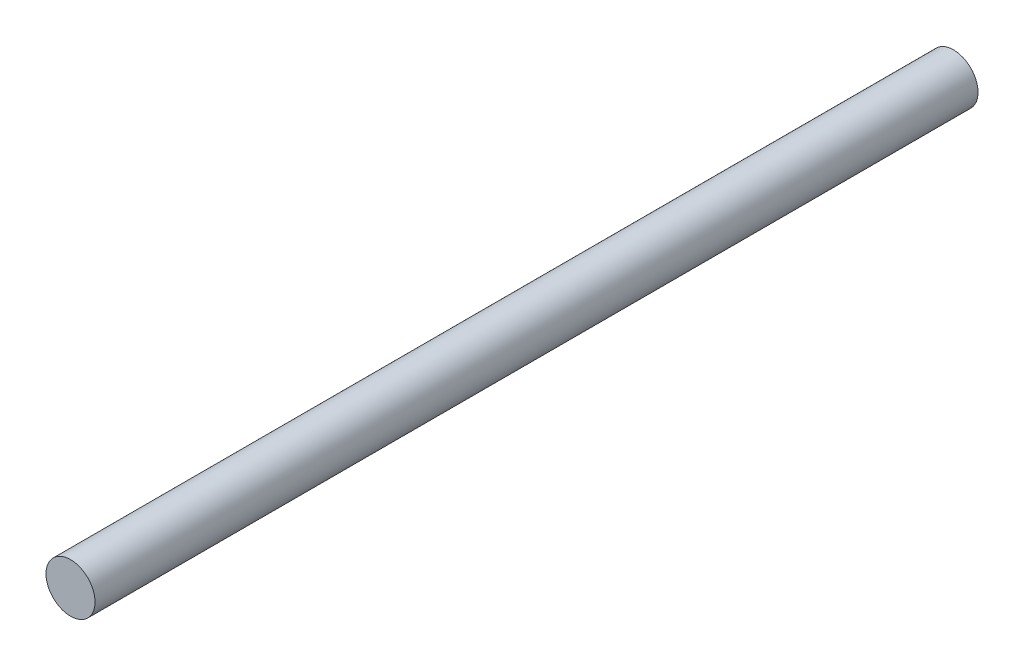
ISO-10303-21;
HEADER;
FILE_DESCRIPTION(('STEP AP214'),'2;1');
FILE_NAME('part.step','',(''),(''),'','','');
FILE_SCHEMA(('AUTOMOTIVE_DESIGN { 1 0 10303 214 1 1 1 1 }'));
ENDSEC;
DATA;
#1=APPLICATION_CONTEXT('core data for automotive mechanical design processes');
#2=APPLICATION_PROTOCOL_DEFINITION('international standard','automotive_design',2000,#1);
#3=PRODUCT_CONTEXT('',#1,'mechanical');
#4=PRODUCT('Part','Part','',(#3));
#5=PRODUCT_RELATED_PRODUCT_CATEGORY('part','',(#4));
#6=PRODUCT_DEFINITION_FORMATION('','',#4);
#7=PRODUCT_DEFINITION_CONTEXT('part definition',#1,'design');
#8=PRODUCT_DEFINITION('design','',#6,#7);
#9=PRODUCT_DEFINITION_SHAPE('','',#8);
#10=(LENGTH_UNIT() NAMED_UNIT(*) SI_UNIT(.MILLI.,.METRE.));
#11=(NAMED_UNIT(*) PLANE_ANGLE_UNIT() SI_UNIT($,.RADIAN.));
#12=(NAMED_UNIT(*) SI_UNIT($,.STERADIAN.) SOLID_ANGLE_UNIT());
#13=UNCERTAINTY_MEASURE_WITH_UNIT(LENGTH_MEASURE(1.E-05),#10,'distance_accuracy_value','');
#14=(GEOMETRIC_REPRESENTATION_CONTEXT(3) GLOBAL_UNCERTAINTY_ASSIGNED_CONTEXT((#13)) GLOBAL_UNIT_ASSIGNED_CONTEXT((#10,
#11,#12)) REPRESENTATION_CONTEXT('',''));
#15=CARTESIAN_POINT('',(0.,0.,0.));
#16=DIRECTION('',(0.,0.,1.));
#17=DIRECTION('',(1.,0.,0.));
#18=AXIS2_PLACEMENT_3D('',#15,#16,#17);
#19=CARTESIAN_POINT('',(0.,0.,90.));
#20=DIRECTION('',(0.,0.,-1.));
#21=DIRECTION('',(-1.,0.,0.));
#22=AXIS2_PLACEMENT_3D('',#19,#20,#21);
#23=CYLINDRICAL_SURFACE('',#22,2.5);
#24=CARTESIAN_POINT('',(0.,0.,90.));
#25=DIRECTION('',(0.,0.,1.));
#26=DIRECTION('',(1.,0.,0.));
#27=AXIS2_PLACEMENT_3D('',#24,#25,#26);
#28=CIRCLE('',#27,2.5);
#29=CARTESIAN_POINT('',(-2.5,0.,90.));
#30=VERTEX_POINT('',#29);
#31=EDGE_CURVE('E10',#30,#30,#28,.T.);
#32=CARTESIAN_POINT('',(0.,0.,0.));
#33=DIRECTION('',(0.,0.,1.));
#34=DIRECTION('',(1.,0.,0.));
#35=AXIS2_PLACEMENT_3D('',#32,#33,#34);
#36=CIRCLE('',#35,2.5);
#37=CARTESIAN_POINT('',(-2.5,0.,0.));
#38=VERTEX_POINT('',#37);
#39=EDGE_CURVE('E42',#38,#38,#36,.T.);
#40=CARTESIAN_POINT('',(-2.5,0.,90.));
#41=CARTESIAN_POINT('',(-2.5,0.,89.0625));
#42=CARTESIAN_POINT('',(-2.5,0.,88.125));
#43=CARTESIAN_POINT('',(-2.5,0.,86.25));
#44=CARTESIAN_POINT('',(-2.5,0.,85.3125));
#45=CARTESIAN_POINT('',(-2.5,0.,83.4375));
#46=CARTESIAN_POINT('',(-2.5,0.,82.5));
#47=CARTESIAN_POINT('',(-2.5,0.,80.625));
#48=CARTESIAN_POINT('',(-2.5,0.,79.6875));
#49=CARTESIAN_POINT('',(-2.5,0.,77.8125));
#50=CARTESIAN_POINT('',(-2.5,0.,76.875));
#51=CARTESIAN_POINT('',(-2.5,0.,75.));
#52=CARTESIAN_POINT('',(-2.5,0.,74.0625));
#53=CARTESIAN_POINT('',(-2.5,0.,72.1875));
#54=CARTESIAN_POINT('',(-2.5,0.,71.25));
#55=CARTESIAN_POINT('',(-2.5,0.,69.375));
#56=CARTESIAN_POINT('',(-2.5,0.,68.4375));
#57=CARTESIAN_POINT('',(-2.5,0.,66.5625));
#58=CARTESIAN_POINT('',(-2.5,0.,65.625));
#59=CARTESIAN_POINT('',(-2.5,0.,63.75));
#60=CARTESIAN_POINT('',(-2.5,0.,62.8125));
#61=CARTESIAN_POINT('',(-2.5,0.,60.9375));
#62=CARTESIAN_POINT('',(-2.5,0.,60.));
#63=CARTESIAN_POINT('',(-2.5,0.,58.125));
#64=CARTESIAN_POINT('',(-2.5,0.,57.1875));
#65=CARTESIAN_POINT('',(-2.5,0.,55.3125));
#66=CARTESIAN_POINT('',(-2.5,0.,54.375));
#67=CARTESIAN_POINT('',(-2.5,0.,52.5));
#68=CARTESIAN_POINT('',(-2.5,0.,51.5625));
#69=CARTESIAN_POINT('',(-2.5,0.,49.6875));
#70=CARTESIAN_POINT('',(-2.5,0.,48.75));
#71=CARTESIAN_POINT('',(-2.5,0.,46.875));
#72=CARTESIAN_POINT('',(-2.5,0.,45.9375));
#73=CARTESIAN_POINT('',(-2.5,0.,44.0625));
#74=CARTESIAN_POINT('',(-2.5,0.,43.125));
#75=CARTESIAN_POINT('',(-2.5,0.,41.25));
#76=CARTESIAN_POINT('',(-2.5,0.,40.3125));
#77=CARTESIAN_POINT('',(-2.5,0.,38.4375));
#78=CARTESIAN_POINT('',(-2.5,0.,37.5));
#79=CARTESIAN_POINT('',(-2.5,0.,35.625));
#80=CARTESIAN_POINT('',(-2.5,0.,34.6875));
#81=CARTESIAN_POINT('',(-2.5,0.,32.8125));
#82=CARTESIAN_POINT('',(-2.5,0.,31.875));
#83=CARTESIAN_POINT('',(-2.5,0.,30.));
#84=CARTESIAN_POINT('',(-2.5,0.,29.0625));
#85=CARTESIAN_POINT('',(-2.5,0.,27.1875));
#86=CARTESIAN_POINT('',(-2.5,0.,26.25));
#87=CARTESIAN_POINT('',(-2.5,0.,24.375));
#88=CARTESIAN_POINT('',(-2.5,0.,23.4375));
#89=CARTESIAN_POINT('',(-2.5,0.,21.5625));
#90=CARTESIAN_POINT('',(-2.5,0.,20.625));
#91=CARTESIAN_POINT('',(-2.5,0.,18.75));
#92=CARTESIAN_POINT('',(-2.5,0.,17.8125));
#93=CARTESIAN_POINT('',(-2.5,0.,15.9375));
#94=CARTESIAN_POINT('',(-2.5,0.,15.));
#95=CARTESIAN_POINT('',(-2.5,0.,13.125));
#96=CARTESIAN_POINT('',(-2.5,0.,12.1875));
#97=CARTESIAN_POINT('',(-2.5,0.,10.3125));
#98=CARTESIAN_POINT('',(-2.5,0.,9.37499999999999));
#99=CARTESIAN_POINT('',(-2.5,0.,7.49999999999999));
#100=CARTESIAN_POINT('',(-2.5,0.,6.56249999999999));
#101=CARTESIAN_POINT('',(-2.5,0.,4.68749999999999));
#102=CARTESIAN_POINT('',(-2.5,0.,3.74999999999998));
#103=CARTESIAN_POINT('',(-2.5,0.,1.87499999999998));
#104=CARTESIAN_POINT('',(-2.5,0.,0.937499999999986));
#105=CARTESIAN_POINT('',(-2.5,0.,0.));
#106=B_SPLINE_CURVE_WITH_KNOTS('',3,(#40,#41,#42,#43,#44,#45,#46,#47,#48,#49,#50,#51,#52,#53,
#54,#55,#56,#57,#58,#59,#60,#61,#62,#63,#64,#65,#66,#67,#68,#69,#70,#71,#72,#73,#74,#75,#76,#77,
#78,#79,#80,#81,#82,#83,#84,#85,#86,#87,#88,#89,#90,#91,#92,#93,#94,#95,#96,#97,#98,#99,#100,
#101,#102,#103,#104,#105),.UNSPECIFIED.,.F.,.F.,(4,2,2,2,2,2,2,2,2,2,2,2,2,2,2,2,2,2,2,2,2,2,2,
2,2,2,2,2,2,2,2,2,4),(0.,2.81250000000001,5.62500000000001,8.43750000000001,11.25,14.0625,
16.875,19.6875,22.5,25.3125,28.125,30.9375,33.75,36.5625,39.375,42.1875,45.,47.8125,50.625,
53.4375,56.25,59.0625,61.875,64.6875,67.5,70.3125,73.125,75.9375,78.75,81.5625,84.375,87.1875,
90.),.UNSPECIFIED.);
#107=EDGE_CURVE('BSEAM39',#30,#38,#106,.T.);
#108=ORIENTED_EDGE('',*,*,#31,.F.);
#109=ORIENTED_EDGE('',*,*,#39,.T.);
#110=ORIENTED_EDGE('',*,*,#107,.T.);
#111=ORIENTED_EDGE('',*,*,#107,.F.);
#112=EDGE_LOOP('',(#108,#110,#109,#111));
#113=FACE_BOUND('',#112,.T.);
#114=ADVANCED_FACE('F39',(#113),#23,.T.);
#115=CARTESIAN_POINT('',(0.,0.,90.));
#116=DIRECTION('',(0.,0.,1.));
#117=DIRECTION('',(1.,0.,0.));
#118=AXIS2_PLACEMENT_3D('',#115,#116,#117);
#119=PLANE('',#118);
#120=ORIENTED_EDGE('',*,*,#31,.T.);
#121=EDGE_LOOP('',(#120));
#122=FACE_BOUND('',#121,.T.);
#123=ADVANCED_FACE('F56',(#122),#119,.T.);
#124=CARTESIAN_POINT('',(0.,0.,0.));
#125=DIRECTION('',(0.,0.,1.));
#126=DIRECTION('',(1.,0.,0.));
#127=AXIS2_PLACEMENT_3D('',#124,#125,#126);
#128=PLANE('',#127);
#129=ORIENTED_EDGE('',*,*,#39,.F.);
#130=EDGE_LOOP('',(#129));
#131=FACE_BOUND('',#130,.T.);
#132=ADVANCED_FACE('F54',(#131),#128,.F.);
#133=CLOSED_SHELL('',(#114,#123,#132));
#134=MANIFOLD_SOLID_BREP('B2',#133);
#135=ADVANCED_BREP_SHAPE_REPRESENTATION('',(#18,#134),#14);
#136=SHAPE_DEFINITION_REPRESENTATION(#9,#135);
ENDSEC;
END-ISO-10303-21;
